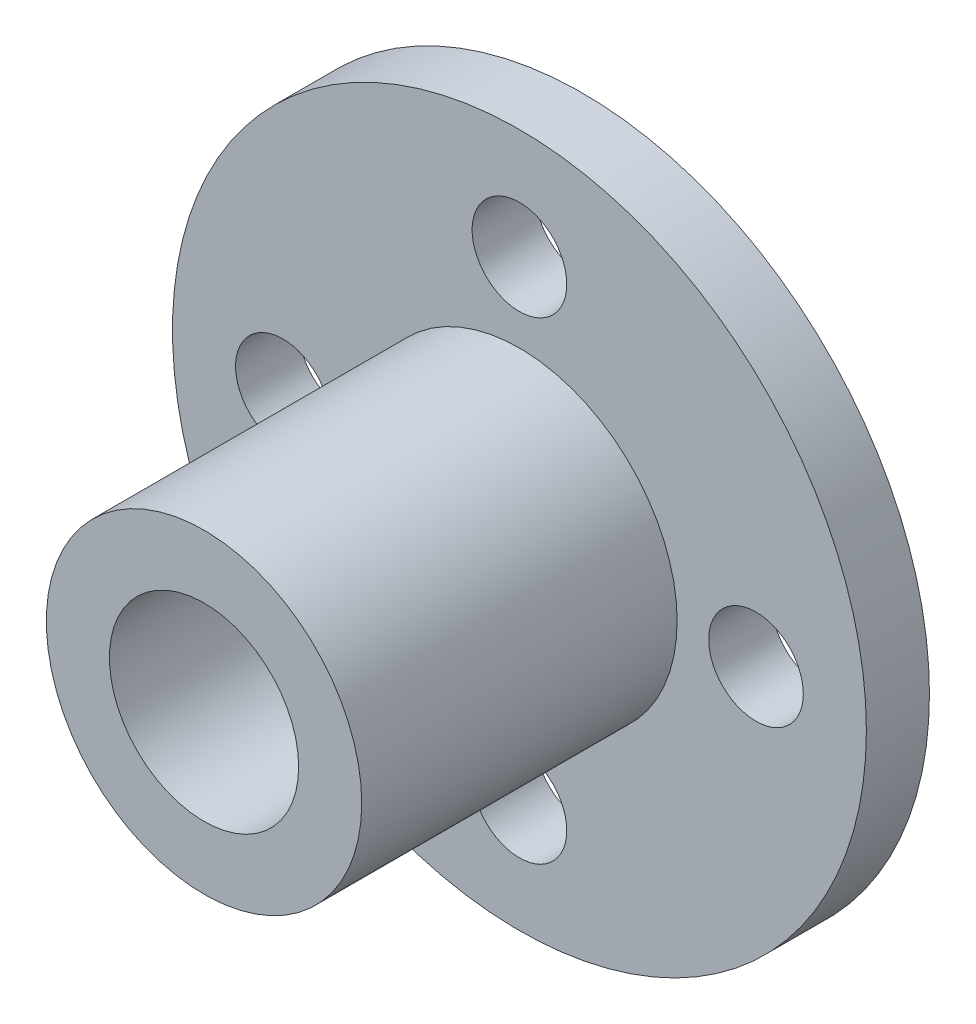
ISO-10303-21;
HEADER;
FILE_DESCRIPTION(('STEP AP214'),'2;1');
FILE_NAME('part.step','',(''),(''),'','','');
FILE_SCHEMA(('AUTOMOTIVE_DESIGN { 1 0 10303 214 1 1 1 1 }'));
ENDSEC;
DATA;
#1=APPLICATION_CONTEXT('core data for automotive mechanical design processes');
#2=APPLICATION_PROTOCOL_DEFINITION('international standard','automotive_design',2000,#1);
#3=PRODUCT_CONTEXT('',#1,'mechanical');
#4=PRODUCT('Part','Part','',(#3));
#5=PRODUCT_RELATED_PRODUCT_CATEGORY('part','',(#4));
#6=PRODUCT_DEFINITION_FORMATION('','',#4);
#7=PRODUCT_DEFINITION_CONTEXT('part definition',#1,'design');
#8=PRODUCT_DEFINITION('design','',#6,#7);
#9=PRODUCT_DEFINITION_SHAPE('','',#8);
#10=(LENGTH_UNIT() NAMED_UNIT(*) SI_UNIT(.MILLI.,.METRE.));
#11=(NAMED_UNIT(*) PLANE_ANGLE_UNIT() SI_UNIT($,.RADIAN.));
#12=(NAMED_UNIT(*) SI_UNIT($,.STERADIAN.) SOLID_ANGLE_UNIT());
#13=UNCERTAINTY_MEASURE_WITH_UNIT(LENGTH_MEASURE(1.E-05),#10,'distance_accuracy_value','');
#14=(GEOMETRIC_REPRESENTATION_CONTEXT(3) GLOBAL_UNCERTAINTY_ASSIGNED_CONTEXT((#13)) GLOBAL_UNIT_ASSIGNED_CONTEXT((#10,
#11,#12)) REPRESENTATION_CONTEXT('',''));
#15=CARTESIAN_POINT('',(0.,0.,0.));
#16=DIRECTION('',(0.,0.,1.));
#17=DIRECTION('',(1.,0.,0.));
#18=AXIS2_PLACEMENT_3D('',#15,#16,#17);
#19=CARTESIAN_POINT('',(0.,0.,2.));
#20=DIRECTION('',(0.,0.,-1.));
#21=DIRECTION('',(-1.,0.,0.));
#22=AXIS2_PLACEMENT_3D('',#19,#20,#21);
#23=CYLINDRICAL_SURFACE('',#22,11.);
#24=CARTESIAN_POINT('',(0.,0.,2.));
#25=DIRECTION('',(0.,0.,1.));
#26=DIRECTION('',(1.,0.,0.));
#27=AXIS2_PLACEMENT_3D('',#24,#25,#26);
#28=CIRCLE('',#27,11.);
#29=CARTESIAN_POINT('',(11.,0.,2.));
#30=VERTEX_POINT('',#29);
#31=EDGE_CURVE('E39',#30,#30,#28,.T.);
#32=ORIENTED_EDGE('',*,*,#31,.F.);
#33=EDGE_LOOP('',(#32));
#34=FACE_BOUND('',#33,.T.);
#35=CARTESIAN_POINT('',(0.,0.,0.));
#36=DIRECTION('',(0.,0.,1.));
#37=DIRECTION('',(1.,0.,0.));
#38=AXIS2_PLACEMENT_3D('',#35,#36,#37);
#39=CIRCLE('',#38,11.);
#40=CARTESIAN_POINT('',(11.,0.,0.));
#41=VERTEX_POINT('',#40);
#42=EDGE_CURVE('E44',#41,#41,#39,.T.);
#43=ORIENTED_EDGE('',*,*,#42,.T.);
#44=EDGE_LOOP('',(#43));
#45=FACE_BOUND('',#44,.T.);
#46=ADVANCED_FACE('F32',(#34,#45),#23,.T.);
#47=CARTESIAN_POINT('',(0.,0.,2.));
#48=DIRECTION('',(0.,0.,1.));
#49=DIRECTION('',(1.,0.,0.));
#50=AXIS2_PLACEMENT_3D('',#47,#48,#49);
#51=PLANE('',#50);
#52=CARTESIAN_POINT('',(0.,7.5,2.));
#53=DIRECTION('',(0.,0.,1.));
#54=DIRECTION('',(1.,0.,0.));
#55=AXIS2_PLACEMENT_3D('',#52,#53,#54);
#56=CIRCLE('',#55,1.5);
#57=CARTESIAN_POINT('',(1.5,7.5,2.));
#58=VERTEX_POINT('',#57);
#59=EDGE_CURVE('E56',#58,#58,#56,.T.);
#60=ORIENTED_EDGE('',*,*,#59,.F.);
#61=EDGE_LOOP('',(#60));
#62=FACE_BOUND('',#61,.T.);
#63=CARTESIAN_POINT('',(7.5,0.,2.));
#64=DIRECTION('',(0.,0.,1.));
#65=DIRECTION('',(1.,0.,0.));
#66=AXIS2_PLACEMENT_3D('',#63,#64,#65);
#67=CIRCLE('',#66,1.5);
#68=CARTESIAN_POINT('',(9.,0.,2.));
#69=VERTEX_POINT('',#68);
#70=EDGE_CURVE('E79',#69,#69,#67,.T.);
#71=ORIENTED_EDGE('',*,*,#70,.F.);
#72=EDGE_LOOP('',(#71));
#73=FACE_BOUND('',#72,.T.);
#74=CARTESIAN_POINT('',(0.,-7.5,2.));
#75=DIRECTION('',(0.,0.,1.));
#76=DIRECTION('',(1.,0.,0.));
#77=AXIS2_PLACEMENT_3D('',#74,#75,#76);
#78=CIRCLE('',#77,1.5);
#79=CARTESIAN_POINT('',(1.49999999999995,-7.5,2.));
#80=VERTEX_POINT('',#79);
#81=EDGE_CURVE('E76',#80,#80,#78,.T.);
#82=ORIENTED_EDGE('',*,*,#81,.F.);
#83=EDGE_LOOP('',(#82));
#84=FACE_BOUND('',#83,.T.);
#85=CARTESIAN_POINT('',(-7.5,0.,2.));
#86=DIRECTION('',(0.,0.,1.));
#87=DIRECTION('',(1.,0.,0.));
#88=AXIS2_PLACEMENT_3D('',#85,#86,#87);
#89=CIRCLE('',#88,1.5);
#90=CARTESIAN_POINT('',(-6.,0.,2.));
#91=VERTEX_POINT('',#90);
#92=EDGE_CURVE('E73',#91,#91,#89,.T.);
#93=ORIENTED_EDGE('',*,*,#92,.F.);
#94=EDGE_LOOP('',(#93));
#95=FACE_BOUND('',#94,.T.);
#96=CARTESIAN_POINT('',(0.,0.,2.));
#97=DIRECTION('',(0.,0.,1.));
#98=DIRECTION('',(1.,0.,0.));
#99=AXIS2_PLACEMENT_3D('',#96,#97,#98);
#100=CIRCLE('',#99,5.);
#101=CARTESIAN_POINT('',(5.,0.,2.));
#102=VERTEX_POINT('',#101);
#103=EDGE_CURVE('E10',#102,#102,#100,.T.);
#104=ORIENTED_EDGE('',*,*,#103,.F.);
#105=EDGE_LOOP('',(#104));
#106=FACE_BOUND('',#105,.T.);
#107=ORIENTED_EDGE('',*,*,#31,.T.);
#108=EDGE_LOOP('',(#107));
#109=FACE_BOUND('',#108,.T.);
#110=ADVANCED_FACE('F88',(#62,#73,#84,#95,#106,#109),#51,.T.);
#111=CARTESIAN_POINT('',(0.,0.,0.));
#112=DIRECTION('',(0.,0.,1.));
#113=DIRECTION('',(1.,0.,0.));
#114=AXIS2_PLACEMENT_3D('',#111,#112,#113);
#115=PLANE('',#114);
#116=CARTESIAN_POINT('',(0.,7.5,0.));
#117=DIRECTION('',(0.,0.,1.));
#118=DIRECTION('',(1.,0.,0.));
#119=AXIS2_PLACEMENT_3D('',#116,#117,#118);
#120=CIRCLE('',#119,1.5);
#121=CARTESIAN_POINT('',(1.5,7.5,0.));
#122=VERTEX_POINT('',#121);
#123=EDGE_CURVE('E35',#122,#122,#120,.T.);
#124=ORIENTED_EDGE('',*,*,#123,.T.);
#125=EDGE_LOOP('',(#124));
#126=FACE_BOUND('',#125,.T.);
#127=CARTESIAN_POINT('',(7.5,0.,0.));
#128=DIRECTION('',(0.,0.,1.));
#129=DIRECTION('',(1.,0.,0.));
#130=AXIS2_PLACEMENT_3D('',#127,#128,#129);
#131=CIRCLE('',#130,1.5);
#132=CARTESIAN_POINT('',(9.,0.,0.));
#133=VERTEX_POINT('',#132);
#134=EDGE_CURVE('E58',#133,#133,#131,.T.);
#135=ORIENTED_EDGE('',*,*,#134,.T.);
#136=EDGE_LOOP('',(#135));
#137=FACE_BOUND('',#136,.T.);
#138=CARTESIAN_POINT('',(0.,-7.5,0.));
#139=DIRECTION('',(0.,0.,1.));
#140=DIRECTION('',(1.,0.,0.));
#141=AXIS2_PLACEMENT_3D('',#138,#139,#140);
#142=CIRCLE('',#141,1.5);
#143=CARTESIAN_POINT('',(1.49999999999995,-7.5,0.));
#144=VERTEX_POINT('',#143);
#145=EDGE_CURVE('E55',#144,#144,#142,.T.);
#146=ORIENTED_EDGE('',*,*,#145,.T.);
#147=EDGE_LOOP('',(#146));
#148=FACE_BOUND('',#147,.T.);
#149=CARTESIAN_POINT('',(-7.5,0.,0.));
#150=DIRECTION('',(0.,0.,1.));
#151=DIRECTION('',(1.,0.,0.));
#152=AXIS2_PLACEMENT_3D('',#149,#150,#151);
#153=CIRCLE('',#152,1.5);
#154=CARTESIAN_POINT('',(-6.,0.,0.));
#155=VERTEX_POINT('',#154);
#156=EDGE_CURVE('E52',#155,#155,#153,.T.);
#157=ORIENTED_EDGE('',*,*,#156,.T.);
#158=EDGE_LOOP('',(#157));
#159=FACE_BOUND('',#158,.T.);
#160=CARTESIAN_POINT('',(0.,0.,0.));
#161=DIRECTION('',(0.,0.,1.));
#162=DIRECTION('',(1.,0.,0.));
#163=AXIS2_PLACEMENT_3D('',#160,#161,#162);
#164=CIRCLE('',#163,3.);
#165=CARTESIAN_POINT('',(3.,0.,0.));
#166=VERTEX_POINT('',#165);
#167=EDGE_CURVE('E67',#166,#166,#164,.T.);
#168=ORIENTED_EDGE('',*,*,#167,.T.);
#169=EDGE_LOOP('',(#168));
#170=FACE_BOUND('',#169,.T.);
#171=ORIENTED_EDGE('',*,*,#42,.F.);
#172=EDGE_LOOP('',(#171));
#173=FACE_BOUND('',#172,.T.);
#174=ADVANCED_FACE('F91',(#126,#137,#148,#159,#170,#173),#115,.F.);
#175=CARTESIAN_POINT('',(0.,0.,12.));
#176=DIRECTION('',(0.,0.,-1.));
#177=DIRECTION('',(-1.,0.,0.));
#178=AXIS2_PLACEMENT_3D('',#175,#176,#177);
#179=CYLINDRICAL_SURFACE('',#178,5.);
#180=CARTESIAN_POINT('',(0.,0.,12.));
#181=DIRECTION('',(0.,0.,1.));
#182=DIRECTION('',(1.,0.,0.));
#183=AXIS2_PLACEMENT_3D('',#180,#181,#182);
#184=CIRCLE('',#183,5.);
#185=CARTESIAN_POINT('',(5.,0.,12.));
#186=VERTEX_POINT('',#185);
#187=EDGE_CURVE('E47',#186,#186,#184,.T.);
#188=ORIENTED_EDGE('',*,*,#187,.F.);
#189=EDGE_LOOP('',(#188));
#190=FACE_BOUND('',#189,.T.);
#191=ORIENTED_EDGE('',*,*,#103,.T.);
#192=EDGE_LOOP('',(#191));
#193=FACE_BOUND('',#192,.T.);
#194=ADVANCED_FACE('F107',(#190,#193),#179,.T.);
#195=CARTESIAN_POINT('',(0.,0.,12.));
#196=DIRECTION('',(0.,0.,1.));
#197=DIRECTION('',(1.,0.,0.));
#198=AXIS2_PLACEMENT_3D('',#195,#196,#197);
#199=PLANE('',#198);
#200=CARTESIAN_POINT('',(0.,0.,12.));
#201=DIRECTION('',(0.,0.,1.));
#202=DIRECTION('',(1.,0.,0.));
#203=AXIS2_PLACEMENT_3D('',#200,#201,#202);
#204=CIRCLE('',#203,3.);
#205=CARTESIAN_POINT('',(3.,0.,12.));
#206=VERTEX_POINT('',#205);
#207=EDGE_CURVE('E63',#206,#206,#204,.T.);
#208=ORIENTED_EDGE('',*,*,#207,.F.);
#209=EDGE_LOOP('',(#208));
#210=FACE_BOUND('',#209,.T.);
#211=ORIENTED_EDGE('',*,*,#187,.T.);
#212=EDGE_LOOP('',(#211));
#213=FACE_BOUND('',#212,.T.);
#214=ADVANCED_FACE('F111',(#210,#213),#199,.T.);
#215=CARTESIAN_POINT('',(0.,0.,-8.));
#216=DIRECTION('',(0.,0.,1.));
#217=DIRECTION('',(1.,0.,0.));
#218=AXIS2_PLACEMENT_3D('',#215,#216,#217);
#219=CYLINDRICAL_SURFACE('',#218,3.);
#220=ORIENTED_EDGE('',*,*,#207,.T.);
#221=EDGE_LOOP('',(#220));
#222=FACE_BOUND('',#221,.T.);
#223=ORIENTED_EDGE('',*,*,#167,.F.);
#224=EDGE_LOOP('',(#223));
#225=FACE_BOUND('',#224,.T.);
#226=ADVANCED_FACE('F117',(#222,#225),#219,.F.);
#227=CARTESIAN_POINT('',(-7.5,0.,-18.));
#228=DIRECTION('',(0.,0.,1.));
#229=DIRECTION('',(1.,0.,0.));
#230=AXIS2_PLACEMENT_3D('',#227,#228,#229);
#231=CYLINDRICAL_SURFACE('',#230,1.5);
#232=ORIENTED_EDGE('',*,*,#92,.T.);
#233=EDGE_LOOP('',(#232));
#234=FACE_BOUND('',#233,.T.);
#235=ORIENTED_EDGE('',*,*,#156,.F.);
#236=EDGE_LOOP('',(#235));
#237=FACE_BOUND('',#236,.T.);
#238=ADVANCED_FACE('F121',(#234,#237),#231,.F.);
#239=CARTESIAN_POINT('',(0.,-7.5,-18.));
#240=DIRECTION('',(0.,0.,1.));
#241=DIRECTION('',(1.,0.,0.));
#242=AXIS2_PLACEMENT_3D('',#239,#240,#241);
#243=CYLINDRICAL_SURFACE('',#242,1.5);
#244=ORIENTED_EDGE('',*,*,#81,.T.);
#245=EDGE_LOOP('',(#244));
#246=FACE_BOUND('',#245,.T.);
#247=ORIENTED_EDGE('',*,*,#145,.F.);
#248=EDGE_LOOP('',(#247));
#249=FACE_BOUND('',#248,.T.);
#250=ADVANCED_FACE('F124',(#246,#249),#243,.F.);
#251=CARTESIAN_POINT('',(7.5,0.,-18.));
#252=DIRECTION('',(0.,0.,1.));
#253=DIRECTION('',(1.,0.,0.));
#254=AXIS2_PLACEMENT_3D('',#251,#252,#253);
#255=CYLINDRICAL_SURFACE('',#254,1.5);
#256=ORIENTED_EDGE('',*,*,#70,.T.);
#257=EDGE_LOOP('',(#256));
#258=FACE_BOUND('',#257,.T.);
#259=ORIENTED_EDGE('',*,*,#134,.F.);
#260=EDGE_LOOP('',(#259));
#261=FACE_BOUND('',#260,.T.);
#262=ADVANCED_FACE('F128',(#258,#261),#255,.F.);
#263=CARTESIAN_POINT('',(0.,7.5,-18.));
#264=DIRECTION('',(0.,0.,1.));
#265=DIRECTION('',(1.,0.,0.));
#266=AXIS2_PLACEMENT_3D('',#263,#264,#265);
#267=CYLINDRICAL_SURFACE('',#266,1.5);
#268=ORIENTED_EDGE('',*,*,#59,.T.);
#269=EDGE_LOOP('',(#268));
#270=FACE_BOUND('',#269,.T.);
#271=ORIENTED_EDGE('',*,*,#123,.F.);
#272=EDGE_LOOP('',(#271));
#273=FACE_BOUND('',#272,.T.);
#274=ADVANCED_FACE('F85',(#270,#273),#267,.F.);
#275=CLOSED_SHELL('',(#46,#110,#174,#194,#214,#226,#238,#250,#262,#274));
#276=MANIFOLD_SOLID_BREP('B2',#275);
#277=ADVANCED_BREP_SHAPE_REPRESENTATION('',(#18,#276),#14);
#278=SHAPE_DEFINITION_REPRESENTATION(#9,#277);
ENDSEC;
END-ISO-10303-21;
